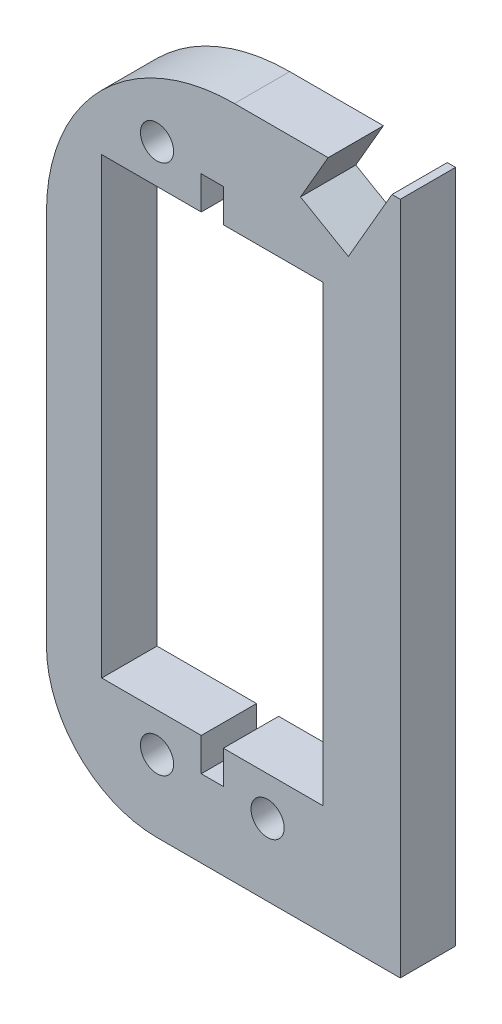
ISO-10303-21;
HEADER;
FILE_DESCRIPTION(('STEP AP214'),'2;1');
FILE_NAME('part.step','',(''),(''),'','','');
FILE_SCHEMA(('AUTOMOTIVE_DESIGN { 1 0 10303 214 1 1 1 1 }'));
ENDSEC;
DATA;
#1=APPLICATION_CONTEXT('core data for automotive mechanical design processes');
#2=APPLICATION_PROTOCOL_DEFINITION('international standard','automotive_design',2000,#1);
#3=PRODUCT_CONTEXT('',#1,'mechanical');
#4=PRODUCT('Part','Part','',(#3));
#5=PRODUCT_RELATED_PRODUCT_CATEGORY('part','',(#4));
#6=PRODUCT_DEFINITION_FORMATION('','',#4);
#7=PRODUCT_DEFINITION_CONTEXT('part definition',#1,'design');
#8=PRODUCT_DEFINITION('design','',#6,#7);
#9=PRODUCT_DEFINITION_SHAPE('','',#8);
#10=(LENGTH_UNIT() NAMED_UNIT(*) SI_UNIT(.MILLI.,.METRE.));
#11=(NAMED_UNIT(*) PLANE_ANGLE_UNIT() SI_UNIT($,.RADIAN.));
#12=(NAMED_UNIT(*) SI_UNIT($,.STERADIAN.) SOLID_ANGLE_UNIT());
#13=UNCERTAINTY_MEASURE_WITH_UNIT(LENGTH_MEASURE(1.E-05),#10,'distance_accuracy_value','');
#14=(GEOMETRIC_REPRESENTATION_CONTEXT(3) GLOBAL_UNCERTAINTY_ASSIGNED_CONTEXT((#13)) GLOBAL_UNIT_ASSIGNED_CONTEXT((#10,
#11,#12)) REPRESENTATION_CONTEXT('',''));
#15=CARTESIAN_POINT('',(0.,0.,0.));
#16=DIRECTION('',(0.,0.,1.));
#17=DIRECTION('',(1.,0.,0.));
#18=AXIS2_PLACEMENT_3D('',#15,#16,#17);
#19=CARTESIAN_POINT('',(0.,0.,5.));
#20=DIRECTION('',(0.,0.,-1.));
#21=DIRECTION('',(-1.,0.,0.));
#22=AXIS2_PLACEMENT_3D('',#19,#20,#21);
#23=PLANE('',#22);
#24=CARTESIAN_POINT('',(20.,6.50000000000001,5.));
#25=DIRECTION('',(0.,0.,1.));
#26=DIRECTION('',(1.,0.,0.));
#27=AXIS2_PLACEMENT_3D('',#24,#25,#26);
#28=CIRCLE('',#27,1.5);
#29=CARTESIAN_POINT('',(21.5,6.50000000000001,5.));
#30=VERTEX_POINT('',#29);
#31=EDGE_CURVE('E673',#30,#30,#28,.T.);
#32=ORIENTED_EDGE('',*,*,#31,.F.);
#33=EDGE_LOOP('',(#32));
#34=FACE_BOUND('',#33,.T.);
#35=DIRECTION('',(1.,0.,0.));
#36=VECTOR('',#35,1.);
#37=CARTESIAN_POINT('',(14.,10.,5.));
#38=LINE('',#37,#36);
#39=CARTESIAN_POINT('',(5.,10.,5.));
#40=VERTEX_POINT('',#39);
#41=CARTESIAN_POINT('',(14.,10.,5.));
#42=VERTEX_POINT('',#41);
#43=EDGE_CURVE('E183',#40,#42,#38,.T.);
#44=ORIENTED_EDGE('',*,*,#43,.F.);
#45=DIRECTION('',(0.,-1.,0.));
#46=VECTOR('',#45,1.);
#47=CARTESIAN_POINT('',(5.,51.,5.));
#48=LINE('',#47,#46);
#49=CARTESIAN_POINT('',(5.,51.,5.));
#50=VERTEX_POINT('',#49);
#51=EDGE_CURVE('E229',#50,#40,#48,.T.);
#52=ORIENTED_EDGE('',*,*,#51,.F.);
#53=DIRECTION('',(-1.,0.,0.));
#54=VECTOR('',#53,1.);
#55=CARTESIAN_POINT('',(14.,51.,5.));
#56=LINE('',#55,#54);
#57=CARTESIAN_POINT('',(14.,51.,5.));
#58=VERTEX_POINT('',#57);
#59=EDGE_CURVE('E226',#58,#50,#56,.T.);
#60=ORIENTED_EDGE('',*,*,#59,.F.);
#61=DIRECTION('',(0.,-1.,0.));
#62=VECTOR('',#61,1.);
#63=CARTESIAN_POINT('',(14.,51.,5.));
#64=LINE('',#63,#62);
#65=CARTESIAN_POINT('',(14.,54.,5.));
#66=VERTEX_POINT('',#65);
#67=EDGE_CURVE('E224',#66,#58,#64,.T.);
#68=ORIENTED_EDGE('',*,*,#67,.F.);
#69=DIRECTION('',(-1.,0.,0.));
#70=VECTOR('',#69,1.);
#71=CARTESIAN_POINT('',(14.,54.,5.));
#72=LINE('',#71,#70);
#73=CARTESIAN_POINT('',(16.,54.,5.));
#74=VERTEX_POINT('',#73);
#75=EDGE_CURVE('E222',#74,#66,#72,.T.);
#76=ORIENTED_EDGE('',*,*,#75,.F.);
#77=DIRECTION('',(0.,1.,0.));
#78=VECTOR('',#77,1.);
#79=CARTESIAN_POINT('',(16.,51.,5.));
#80=LINE('',#79,#78);
#81=CARTESIAN_POINT('',(16.,51.,5.));
#82=VERTEX_POINT('',#81);
#83=EDGE_CURVE('E220',#82,#74,#80,.T.);
#84=ORIENTED_EDGE('',*,*,#83,.F.);
#85=DIRECTION('',(-1.,0.,0.));
#86=VECTOR('',#85,1.);
#87=CARTESIAN_POINT('',(25.,51.,5.));
#88=LINE('',#87,#86);
#89=CARTESIAN_POINT('',(25.,51.,5.));
#90=VERTEX_POINT('',#89);
#91=EDGE_CURVE('E218',#90,#82,#88,.T.);
#92=ORIENTED_EDGE('',*,*,#91,.F.);
#93=DIRECTION('',(0.,1.,0.));
#94=VECTOR('',#93,1.);
#95=CARTESIAN_POINT('',(25.,10.,5.));
#96=LINE('',#95,#94);
#97=CARTESIAN_POINT('',(25.,10.,5.));
#98=VERTEX_POINT('',#97);
#99=EDGE_CURVE('E216',#98,#90,#96,.T.);
#100=ORIENTED_EDGE('',*,*,#99,.F.);
#101=DIRECTION('',(1.,0.,0.));
#102=VECTOR('',#101,1.);
#103=CARTESIAN_POINT('',(25.,10.,5.));
#104=LINE('',#103,#102);
#105=CARTESIAN_POINT('',(16.,10.,5.));
#106=VERTEX_POINT('',#105);
#107=EDGE_CURVE('E214',#106,#98,#104,.T.);
#108=ORIENTED_EDGE('',*,*,#107,.F.);
#109=DIRECTION('',(0.,1.,0.));
#110=VECTOR('',#109,1.);
#111=CARTESIAN_POINT('',(16.,10.,5.));
#112=LINE('',#111,#110);
#113=CARTESIAN_POINT('',(16.,7.00000000000001,5.));
#114=VERTEX_POINT('',#113);
#115=EDGE_CURVE('E209',#114,#106,#112,.T.);
#116=ORIENTED_EDGE('',*,*,#115,.F.);
#117=DIRECTION('',(1.,0.,0.));
#118=VECTOR('',#117,1.);
#119=CARTESIAN_POINT('',(14.,7.00000000000001,5.));
#120=LINE('',#119,#118);
#121=CARTESIAN_POINT('',(14.,7.00000000000001,5.));
#122=VERTEX_POINT('',#121);
#123=EDGE_CURVE('E207',#122,#114,#120,.T.);
#124=ORIENTED_EDGE('',*,*,#123,.F.);
#125=DIRECTION('',(0.,-1.,0.));
#126=VECTOR('',#125,1.);
#127=CARTESIAN_POINT('',(14.,10.,5.));
#128=LINE('',#127,#126);
#129=EDGE_CURVE('E193',#42,#122,#128,.T.);
#130=ORIENTED_EDGE('',*,*,#129,.F.);
#131=EDGE_LOOP('',(#44,#52,#60,#68,#76,#84,#92,#100,#108,#116,#124,#130));
#132=FACE_BOUND('',#131,.T.);
#133=DIRECTION('',(0.,-1.,0.));
#134=VECTOR('',#133,1.);
#135=CARTESIAN_POINT('',(0.,0.,5.));
#136=LINE('',#135,#134);
#137=CARTESIAN_POINT('',(0.,44.,5.));
#138=VERTEX_POINT('',#137);
#139=CARTESIAN_POINT('',(0.,10.,5.));
#140=VERTEX_POINT('',#139);
#141=EDGE_CURVE('E284',#138,#140,#136,.T.);
#142=ORIENTED_EDGE('',*,*,#141,.T.);
#143=CARTESIAN_POINT('',(10.,10.,5.));
#144=DIRECTION('',(0.,0.,-1.));
#145=DIRECTION('',(-1.,0.,0.));
#146=AXIS2_PLACEMENT_3D('',#143,#144,#145);
#147=CIRCLE('',#146,10.);
#148=CARTESIAN_POINT('',(10.,0.,5.));
#149=VERTEX_POINT('',#148);
#150=EDGE_CURVE('E11',#140,#149,#147,.F.);
#151=ORIENTED_EDGE('',*,*,#150,.T.);
#152=DIRECTION('',(1.,0.,0.));
#153=VECTOR('',#152,1.);
#154=CARTESIAN_POINT('',(0.,0.,5.));
#155=LINE('',#154,#153);
#156=CARTESIAN_POINT('',(32.,0.,5.));
#157=VERTEX_POINT('',#156);
#158=EDGE_CURVE('E286',#149,#157,#155,.T.);
#159=ORIENTED_EDGE('',*,*,#158,.T.);
#160=DIRECTION('',(0.,1.,0.));
#161=VECTOR('',#160,1.);
#162=CARTESIAN_POINT('',(32.,0.,5.));
#163=LINE('',#162,#161);
#164=CARTESIAN_POINT('',(32.,61.,5.));
#165=VERTEX_POINT('',#164);
#166=EDGE_CURVE('E289',#157,#165,#163,.T.);
#167=ORIENTED_EDGE('',*,*,#166,.T.);
#168=DIRECTION('',(-1.,0.,0.));
#169=VECTOR('',#168,1.);
#170=CARTESIAN_POINT('',(31.2507855627294,61.,5.));
#171=LINE('',#170,#169);
#172=CARTESIAN_POINT('',(31.2507855627294,61.,5.));
#173=VERTEX_POINT('',#172);
#174=EDGE_CURVE('E291',#165,#173,#171,.T.);
#175=ORIENTED_EDGE('',*,*,#174,.T.);
#176=DIRECTION('',(-0.5,-0.866025403784438,0.));
#177=VECTOR('',#176,1.);
#178=CARTESIAN_POINT('',(31.2507855627294,61.,5.));
#179=LINE('',#178,#177);
#180=CARTESIAN_POINT('',(27.3074098897553,54.1698729810778,5.));
#181=VERTEX_POINT('',#180);
#182=EDGE_CURVE('E293',#173,#181,#179,.T.);
#183=ORIENTED_EDGE('',*,*,#182,.T.);
#184=DIRECTION('',(-0.866025403784438,0.500000000000001,0.));
#185=VECTOR('',#184,1.);
#186=CARTESIAN_POINT('',(27.3074098897553,54.1698729810778,5.));
#187=LINE('',#186,#185);
#188=CARTESIAN_POINT('',(22.9772828708331,56.6698729810778,5.));
#189=VERTEX_POINT('',#188);
#190=EDGE_CURVE('E295',#181,#189,#187,.T.);
#191=ORIENTED_EDGE('',*,*,#190,.T.);
#192=DIRECTION('',(0.499999999999998,0.86602540378444,0.));
#193=VECTOR('',#192,1.);
#194=CARTESIAN_POINT('',(22.9772828708331,56.6698729810778,5.));
#195=LINE('',#194,#193);
#196=CARTESIAN_POINT('',(25.4772828708331,61.,5.));
#197=VERTEX_POINT('',#196);
#198=EDGE_CURVE('E297',#189,#197,#195,.T.);
#199=ORIENTED_EDGE('',*,*,#198,.T.);
#200=DIRECTION('',(-1.,0.,0.));
#201=VECTOR('',#200,1.);
#202=CARTESIAN_POINT('',(15.,61.,5.));
#203=LINE('',#202,#201);
#204=CARTESIAN_POINT('',(17.,61.,5.));
#205=VERTEX_POINT('',#204);
#206=EDGE_CURVE('E299',#197,#205,#203,.T.);
#207=ORIENTED_EDGE('',*,*,#206,.T.);
#208=CARTESIAN_POINT('',(17.,44.,5.));
#209=DIRECTION('',(0.,0.,-1.));
#210=DIRECTION('',(-1.,0.,0.));
#211=AXIS2_PLACEMENT_3D('',#208,#209,#210);
#212=CIRCLE('',#211,17.);
#213=EDGE_CURVE('E343',#205,#138,#212,.F.);
#214=ORIENTED_EDGE('',*,*,#213,.T.);
#215=EDGE_LOOP('',(#142,#151,#159,#167,#175,#183,#191,#199,#207,#214));
#216=FACE_BOUND('',#215,.T.);
#217=CARTESIAN_POINT('',(9.99999999999999,54.5,5.));
#218=DIRECTION('',(0.,0.,1.));
#219=DIRECTION('',(1.,0.,0.));
#220=AXIS2_PLACEMENT_3D('',#217,#218,#219);
#221=CIRCLE('',#220,1.5);
#222=CARTESIAN_POINT('',(11.5,54.5,5.));
#223=VERTEX_POINT('',#222);
#224=EDGE_CURVE('E233',#223,#223,#221,.T.);
#225=ORIENTED_EDGE('',*,*,#224,.F.);
#226=EDGE_LOOP('',(#225));
#227=FACE_BOUND('',#226,.T.);
#228=CARTESIAN_POINT('',(9.99999999999999,6.50000000000001,5.));
#229=DIRECTION('',(0.,0.,1.));
#230=DIRECTION('',(-1.,0.,0.));
#231=AXIS2_PLACEMENT_3D('',#228,#229,#230);
#232=CIRCLE('',#231,1.5);
#233=CARTESIAN_POINT('',(8.49999999999999,6.50000000000001,5.));
#234=VERTEX_POINT('',#233);
#235=EDGE_CURVE('E680',#234,#234,#232,.T.);
#236=ORIENTED_EDGE('',*,*,#235,.F.);
#237=EDGE_LOOP('',(#236));
#238=FACE_BOUND('',#237,.T.);
#239=ADVANCED_FACE('F33',(#34,#132,#216,#227,#238),#23,.F.);
#240=CARTESIAN_POINT('',(0.,0.,0.));
#241=DIRECTION('',(0.,0.,-1.));
#242=DIRECTION('',(-1.,0.,0.));
#243=AXIS2_PLACEMENT_3D('',#240,#241,#242);
#244=PLANE('',#243);
#245=CARTESIAN_POINT('',(20.,6.50000000000001,0.));
#246=DIRECTION('',(0.,0.,1.));
#247=DIRECTION('',(1.,0.,0.));
#248=AXIS2_PLACEMENT_3D('',#245,#246,#247);
#249=CIRCLE('',#248,1.5);
#250=CARTESIAN_POINT('',(21.5,6.50000000000001,0.));
#251=VERTEX_POINT('',#250);
#252=EDGE_CURVE('E676',#251,#251,#249,.T.);
#253=ORIENTED_EDGE('',*,*,#252,.T.);
#254=EDGE_LOOP('',(#253));
#255=FACE_BOUND('',#254,.T.);
#256=DIRECTION('',(0.,-1.,0.));
#257=VECTOR('',#256,1.);
#258=CARTESIAN_POINT('',(5.,51.,0.));
#259=LINE('',#258,#257);
#260=CARTESIAN_POINT('',(5.,51.,0.));
#261=VERTEX_POINT('',#260);
#262=CARTESIAN_POINT('',(5.,10.,0.));
#263=VERTEX_POINT('',#262);
#264=EDGE_CURVE('E194',#261,#263,#259,.T.);
#265=ORIENTED_EDGE('',*,*,#264,.T.);
#266=DIRECTION('',(1.,0.,0.));
#267=VECTOR('',#266,1.);
#268=CARTESIAN_POINT('',(14.,10.,0.));
#269=LINE('',#268,#267);
#270=CARTESIAN_POINT('',(14.,10.,0.));
#271=VERTEX_POINT('',#270);
#272=EDGE_CURVE('E231',#263,#271,#269,.T.);
#273=ORIENTED_EDGE('',*,*,#272,.T.);
#274=DIRECTION('',(0.,-1.,0.));
#275=VECTOR('',#274,1.);
#276=CARTESIAN_POINT('',(14.,10.,0.));
#277=LINE('',#276,#275);
#278=CARTESIAN_POINT('',(14.,7.00000000000001,0.));
#279=VERTEX_POINT('',#278);
#280=EDGE_CURVE('E200',#271,#279,#277,.T.);
#281=ORIENTED_EDGE('',*,*,#280,.T.);
#282=DIRECTION('',(1.,0.,0.));
#283=VECTOR('',#282,1.);
#284=CARTESIAN_POINT('',(14.,7.00000000000001,0.));
#285=LINE('',#284,#283);
#286=CARTESIAN_POINT('',(16.,7.00000000000001,0.));
#287=VERTEX_POINT('',#286);
#288=EDGE_CURVE('E235',#279,#287,#285,.T.);
#289=ORIENTED_EDGE('',*,*,#288,.T.);
#290=DIRECTION('',(0.,1.,0.));
#291=VECTOR('',#290,1.);
#292=CARTESIAN_POINT('',(16.,10.,0.));
#293=LINE('',#292,#291);
#294=CARTESIAN_POINT('',(16.,10.,0.));
#295=VERTEX_POINT('',#294);
#296=EDGE_CURVE('E238',#287,#295,#293,.T.);
#297=ORIENTED_EDGE('',*,*,#296,.T.);
#298=DIRECTION('',(1.,0.,0.));
#299=VECTOR('',#298,1.);
#300=CARTESIAN_POINT('',(25.,10.,0.));
#301=LINE('',#300,#299);
#302=CARTESIAN_POINT('',(25.,10.,0.));
#303=VERTEX_POINT('',#302);
#304=EDGE_CURVE('E241',#295,#303,#301,.T.);
#305=ORIENTED_EDGE('',*,*,#304,.T.);
#306=DIRECTION('',(0.,1.,0.));
#307=VECTOR('',#306,1.);
#308=CARTESIAN_POINT('',(25.,10.,0.));
#309=LINE('',#308,#307);
#310=CARTESIAN_POINT('',(25.,51.,0.));
#311=VERTEX_POINT('',#310);
#312=EDGE_CURVE('E244',#303,#311,#309,.T.);
#313=ORIENTED_EDGE('',*,*,#312,.T.);
#314=DIRECTION('',(-1.,0.,0.));
#315=VECTOR('',#314,1.);
#316=CARTESIAN_POINT('',(25.,51.,0.));
#317=LINE('',#316,#315);
#318=CARTESIAN_POINT('',(16.,51.,0.));
#319=VERTEX_POINT('',#318);
#320=EDGE_CURVE('E247',#311,#319,#317,.T.);
#321=ORIENTED_EDGE('',*,*,#320,.T.);
#322=DIRECTION('',(0.,1.,0.));
#323=VECTOR('',#322,1.);
#324=CARTESIAN_POINT('',(16.,51.,0.));
#325=LINE('',#324,#323);
#326=CARTESIAN_POINT('',(16.,54.,0.));
#327=VERTEX_POINT('',#326);
#328=EDGE_CURVE('E250',#319,#327,#325,.T.);
#329=ORIENTED_EDGE('',*,*,#328,.T.);
#330=DIRECTION('',(-1.,0.,0.));
#331=VECTOR('',#330,1.);
#332=CARTESIAN_POINT('',(14.,54.,0.));
#333=LINE('',#332,#331);
#334=CARTESIAN_POINT('',(14.,54.,0.));
#335=VERTEX_POINT('',#334);
#336=EDGE_CURVE('E253',#327,#335,#333,.T.);
#337=ORIENTED_EDGE('',*,*,#336,.T.);
#338=DIRECTION('',(0.,-1.,0.));
#339=VECTOR('',#338,1.);
#340=CARTESIAN_POINT('',(14.,51.,0.));
#341=LINE('',#340,#339);
#342=CARTESIAN_POINT('',(14.,51.,0.));
#343=VERTEX_POINT('',#342);
#344=EDGE_CURVE('E256',#335,#343,#341,.T.);
#345=ORIENTED_EDGE('',*,*,#344,.T.);
#346=DIRECTION('',(-1.,0.,0.));
#347=VECTOR('',#346,1.);
#348=CARTESIAN_POINT('',(14.,51.,0.));
#349=LINE('',#348,#347);
#350=EDGE_CURVE('E259',#343,#261,#349,.T.);
#351=ORIENTED_EDGE('',*,*,#350,.T.);
#352=EDGE_LOOP('',(#265,#273,#281,#289,#297,#305,#313,#321,#329,#337,#345,#351));
#353=FACE_BOUND('',#352,.T.);
#354=DIRECTION('',(1.,0.,0.));
#355=VECTOR('',#354,1.);
#356=CARTESIAN_POINT('',(25.,0.,0.));
#357=LINE('',#356,#355);
#358=CARTESIAN_POINT('',(10.,0.,0.));
#359=VERTEX_POINT('',#358);
#360=CARTESIAN_POINT('',(32.,0.,0.));
#361=VERTEX_POINT('',#360);
#362=EDGE_CURVE('E304',#359,#361,#357,.T.);
#363=ORIENTED_EDGE('',*,*,#362,.F.);
#364=CARTESIAN_POINT('',(10.,10.,0.));
#365=DIRECTION('',(0.,0.,-1.));
#366=DIRECTION('',(-1.,0.,0.));
#367=AXIS2_PLACEMENT_3D('',#364,#365,#366);
#368=CIRCLE('',#367,10.);
#369=CARTESIAN_POINT('',(0.,10.,0.));
#370=VERTEX_POINT('',#369);
#371=EDGE_CURVE('E55',#359,#370,#368,.T.);
#372=ORIENTED_EDGE('',*,*,#371,.T.);
#373=DIRECTION('',(0.,-1.,0.));
#374=VECTOR('',#373,1.);
#375=CARTESIAN_POINT('',(0.,0.,0.));
#376=LINE('',#375,#374);
#377=CARTESIAN_POINT('',(0.,44.,0.));
#378=VERTEX_POINT('',#377);
#379=EDGE_CURVE('E201',#378,#370,#376,.T.);
#380=ORIENTED_EDGE('',*,*,#379,.F.);
#381=CARTESIAN_POINT('',(17.,44.,0.));
#382=DIRECTION('',(0.,0.,-1.));
#383=DIRECTION('',(-1.,0.,0.));
#384=AXIS2_PLACEMENT_3D('',#381,#382,#383);
#385=CIRCLE('',#384,17.);
#386=CARTESIAN_POINT('',(17.,61.,0.));
#387=VERTEX_POINT('',#386);
#388=EDGE_CURVE('E339',#378,#387,#385,.T.);
#389=ORIENTED_EDGE('',*,*,#388,.T.);
#390=DIRECTION('',(-1.,0.,0.));
#391=VECTOR('',#390,1.);
#392=CARTESIAN_POINT('',(0.,61.,0.));
#393=LINE('',#392,#391);
#394=CARTESIAN_POINT('',(25.4772828708331,61.,0.));
#395=VERTEX_POINT('',#394);
#396=EDGE_CURVE('E287',#395,#387,#393,.T.);
#397=ORIENTED_EDGE('',*,*,#396,.F.);
#398=DIRECTION('',(0.499999999999998,0.86602540378444,0.));
#399=VECTOR('',#398,1.);
#400=CARTESIAN_POINT('',(22.9772828708331,56.6698729810778,0.));
#401=LINE('',#400,#399);
#402=CARTESIAN_POINT('',(22.9772828708331,56.6698729810778,0.));
#403=VERTEX_POINT('',#402);
#404=EDGE_CURVE('E314',#403,#395,#401,.T.);
#405=ORIENTED_EDGE('',*,*,#404,.F.);
#406=DIRECTION('',(-0.866025403784438,0.500000000000001,0.));
#407=VECTOR('',#406,1.);
#408=CARTESIAN_POINT('',(27.3074098897553,54.1698729810778,0.));
#409=LINE('',#408,#407);
#410=CARTESIAN_POINT('',(27.3074098897553,54.1698729810778,0.));
#411=VERTEX_POINT('',#410);
#412=EDGE_CURVE('E312',#411,#403,#409,.T.);
#413=ORIENTED_EDGE('',*,*,#412,.F.);
#414=DIRECTION('',(-0.5,-0.866025403784438,0.));
#415=VECTOR('',#414,1.);
#416=CARTESIAN_POINT('',(31.2507855627294,61.,0.));
#417=LINE('',#416,#415);
#418=CARTESIAN_POINT('',(31.2507855627294,61.,0.));
#419=VERTEX_POINT('',#418);
#420=EDGE_CURVE('E310',#419,#411,#417,.T.);
#421=ORIENTED_EDGE('',*,*,#420,.F.);
#422=DIRECTION('',(-1.,0.,0.));
#423=VECTOR('',#422,1.);
#424=CARTESIAN_POINT('',(31.2507855627294,61.,0.));
#425=LINE('',#424,#423);
#426=CARTESIAN_POINT('',(32.,61.,0.));
#427=VERTEX_POINT('',#426);
#428=EDGE_CURVE('E308',#427,#419,#425,.T.);
#429=ORIENTED_EDGE('',*,*,#428,.F.);
#430=DIRECTION('',(0.,1.,0.));
#431=VECTOR('',#430,1.);
#432=CARTESIAN_POINT('',(32.,0.,0.));
#433=LINE('',#432,#431);
#434=EDGE_CURVE('E306',#361,#427,#433,.T.);
#435=ORIENTED_EDGE('',*,*,#434,.F.);
#436=EDGE_LOOP('',(#363,#372,#380,#389,#397,#405,#413,#421,#429,#435));
#437=FACE_BOUND('',#436,.T.);
#438=CARTESIAN_POINT('',(9.99999999999999,54.5,0.));
#439=DIRECTION('',(0.,0.,1.));
#440=DIRECTION('',(1.,0.,0.));
#441=AXIS2_PLACEMENT_3D('',#438,#439,#440);
#442=CIRCLE('',#441,1.5);
#443=CARTESIAN_POINT('',(11.5,54.5,0.));
#444=VERTEX_POINT('',#443);
#445=EDGE_CURVE('E672',#444,#444,#442,.T.);
#446=ORIENTED_EDGE('',*,*,#445,.T.);
#447=EDGE_LOOP('',(#446));
#448=FACE_BOUND('',#447,.T.);
#449=CARTESIAN_POINT('',(9.99999999999999,6.50000000000001,0.));
#450=DIRECTION('',(0.,0.,1.));
#451=DIRECTION('',(-1.,0.,0.));
#452=AXIS2_PLACEMENT_3D('',#449,#450,#451);
#453=CIRCLE('',#452,1.5);
#454=CARTESIAN_POINT('',(8.49999999999999,6.50000000000001,0.));
#455=VERTEX_POINT('',#454);
#456=EDGE_CURVE('E682',#455,#455,#453,.T.);
#457=ORIENTED_EDGE('',*,*,#456,.T.);
#458=EDGE_LOOP('',(#457));
#459=FACE_BOUND('',#458,.T.);
#460=ADVANCED_FACE('F356',(#255,#353,#437,#448,#459),#244,.T.);
#461=CARTESIAN_POINT('',(0.,0.,5.));
#462=DIRECTION('',(1.,0.,0.));
#463=DIRECTION('',(0.,0.,-1.));
#464=AXIS2_PLACEMENT_3D('',#461,#462,#463);
#465=PLANE('',#464);
#466=ORIENTED_EDGE('',*,*,#379,.T.);
#467=DIRECTION('',(0.,0.,-1.));
#468=VECTOR('',#467,1.);
#469=CARTESIAN_POINT('',(0.,10.,5.));
#470=LINE('',#469,#468);
#471=EDGE_CURVE('E41',#370,#140,#470,.F.);
#472=ORIENTED_EDGE('',*,*,#471,.T.);
#473=ORIENTED_EDGE('',*,*,#141,.F.);
#474=DIRECTION('',(0.,0.,-1.));
#475=VECTOR('',#474,1.);
#476=CARTESIAN_POINT('',(0.,44.,5.));
#477=LINE('',#476,#475);
#478=EDGE_CURVE('E336',#138,#378,#477,.T.);
#479=ORIENTED_EDGE('',*,*,#478,.T.);
#480=EDGE_LOOP('',(#466,#472,#473,#479));
#481=FACE_BOUND('',#480,.T.);
#482=ADVANCED_FACE('F385',(#481),#465,.F.);
#483=CARTESIAN_POINT('',(25.,0.,5.));
#484=DIRECTION('',(0.,1.,0.));
#485=DIRECTION('',(0.,0.,1.));
#486=AXIS2_PLACEMENT_3D('',#483,#484,#485);
#487=PLANE('',#486);
#488=ORIENTED_EDGE('',*,*,#158,.F.);
#489=DIRECTION('',(0.,0.,-1.));
#490=VECTOR('',#489,1.);
#491=CARTESIAN_POINT('',(10.,0.,5.));
#492=LINE('',#491,#490);
#493=EDGE_CURVE('E345',#149,#359,#492,.T.);
#494=ORIENTED_EDGE('',*,*,#493,.T.);
#495=ORIENTED_EDGE('',*,*,#362,.T.);
#496=DIRECTION('',(0.,0.,-1.));
#497=VECTOR('',#496,1.);
#498=CARTESIAN_POINT('',(32.,0.,5.));
#499=LINE('',#498,#497);
#500=EDGE_CURVE('E333',#157,#361,#499,.T.);
#501=ORIENTED_EDGE('',*,*,#500,.F.);
#502=EDGE_LOOP('',(#488,#494,#495,#501));
#503=FACE_BOUND('',#502,.T.);
#504=ADVANCED_FACE('F351',(#503),#487,.F.);
#505=CARTESIAN_POINT('',(32.,0.,5.));
#506=DIRECTION('',(-1.,0.,0.));
#507=DIRECTION('',(0.,0.,1.));
#508=AXIS2_PLACEMENT_3D('',#505,#506,#507);
#509=PLANE('',#508);
#510=ORIENTED_EDGE('',*,*,#434,.T.);
#511=DIRECTION('',(0.,0.,-1.));
#512=VECTOR('',#511,1.);
#513=CARTESIAN_POINT('',(32.,61.,5.));
#514=LINE('',#513,#512);
#515=EDGE_CURVE('E330',#165,#427,#514,.T.);
#516=ORIENTED_EDGE('',*,*,#515,.F.);
#517=ORIENTED_EDGE('',*,*,#166,.F.);
#518=ORIENTED_EDGE('',*,*,#500,.T.);
#519=EDGE_LOOP('',(#510,#516,#517,#518));
#520=FACE_BOUND('',#519,.T.);
#521=ADVANCED_FACE('F362',(#520),#509,.F.);
#522=CARTESIAN_POINT('',(31.2507855627294,61.,5.));
#523=DIRECTION('',(0.,-1.,0.));
#524=DIRECTION('',(0.,0.,-1.));
#525=AXIS2_PLACEMENT_3D('',#522,#523,#524);
#526=PLANE('',#525);
#527=ORIENTED_EDGE('',*,*,#428,.T.);
#528=DIRECTION('',(0.,0.,-1.));
#529=VECTOR('',#528,1.);
#530=CARTESIAN_POINT('',(31.2507855627294,61.,5.));
#531=LINE('',#530,#529);
#532=EDGE_CURVE('E327',#173,#419,#531,.T.);
#533=ORIENTED_EDGE('',*,*,#532,.F.);
#534=ORIENTED_EDGE('',*,*,#174,.F.);
#535=ORIENTED_EDGE('',*,*,#515,.T.);
#536=EDGE_LOOP('',(#527,#533,#534,#535));
#537=FACE_BOUND('',#536,.T.);
#538=ADVANCED_FACE('F366',(#537),#526,.F.);
#539=CARTESIAN_POINT('',(31.2507855627294,61.,5.));
#540=DIRECTION('',(0.866025403784439,-0.5,0.));
#541=DIRECTION('',(0.5,0.866025403784439,0.));
#542=AXIS2_PLACEMENT_3D('',#539,#540,#541);
#543=PLANE('',#542);
#544=ORIENTED_EDGE('',*,*,#420,.T.);
#545=DIRECTION('',(0.,0.,-1.));
#546=VECTOR('',#545,1.);
#547=CARTESIAN_POINT('',(27.3074098897553,54.1698729810778,5.));
#548=LINE('',#547,#546);
#549=EDGE_CURVE('E324',#181,#411,#548,.T.);
#550=ORIENTED_EDGE('',*,*,#549,.F.);
#551=ORIENTED_EDGE('',*,*,#182,.F.);
#552=ORIENTED_EDGE('',*,*,#532,.T.);
#553=EDGE_LOOP('',(#544,#550,#551,#552));
#554=FACE_BOUND('',#553,.T.);
#555=ADVANCED_FACE('F403',(#554),#543,.F.);
#556=CARTESIAN_POINT('',(27.3074098897553,54.1698729810778,5.));
#557=DIRECTION('',(-0.500000000000001,-0.866025403784438,0.));
#558=DIRECTION('',(0.866025403784438,-0.500000000000001,0.));
#559=AXIS2_PLACEMENT_3D('',#556,#557,#558);
#560=PLANE('',#559);
#561=ORIENTED_EDGE('',*,*,#412,.T.);
#562=DIRECTION('',(0.,0.,-1.));
#563=VECTOR('',#562,1.);
#564=CARTESIAN_POINT('',(22.9772828708331,56.6698729810778,5.));
#565=LINE('',#564,#563);
#566=EDGE_CURVE('E321',#189,#403,#565,.T.);
#567=ORIENTED_EDGE('',*,*,#566,.F.);
#568=ORIENTED_EDGE('',*,*,#190,.F.);
#569=ORIENTED_EDGE('',*,*,#549,.T.);
#570=EDGE_LOOP('',(#561,#567,#568,#569));
#571=FACE_BOUND('',#570,.T.);
#572=ADVANCED_FACE('F399',(#571),#560,.F.);
#573=CARTESIAN_POINT('',(22.9772828708331,56.6698729810778,5.));
#574=DIRECTION('',(-0.86602540378444,0.499999999999998,0.));
#575=DIRECTION('',(-0.499999999999998,-0.86602540378444,0.));
#576=AXIS2_PLACEMENT_3D('',#573,#574,#575);
#577=PLANE('',#576);
#578=ORIENTED_EDGE('',*,*,#404,.T.);
#579=DIRECTION('',(0.,0.,-1.));
#580=VECTOR('',#579,1.);
#581=CARTESIAN_POINT('',(25.4772828708331,61.,5.));
#582=LINE('',#581,#580);
#583=EDGE_CURVE('E302',#197,#395,#582,.T.);
#584=ORIENTED_EDGE('',*,*,#583,.F.);
#585=ORIENTED_EDGE('',*,*,#198,.F.);
#586=ORIENTED_EDGE('',*,*,#566,.T.);
#587=EDGE_LOOP('',(#578,#584,#585,#586));
#588=FACE_BOUND('',#587,.T.);
#589=ADVANCED_FACE('F395',(#588),#577,.F.);
#590=CARTESIAN_POINT('',(0.,61.,5.));
#591=DIRECTION('',(0.,-1.,0.));
#592=DIRECTION('',(0.,0.,-1.));
#593=AXIS2_PLACEMENT_3D('',#590,#591,#592);
#594=PLANE('',#593);
#595=ORIENTED_EDGE('',*,*,#396,.T.);
#596=DIRECTION('',(0.,0.,-1.));
#597=VECTOR('',#596,1.);
#598=CARTESIAN_POINT('',(17.,61.,5.));
#599=LINE('',#598,#597);
#600=EDGE_CURVE('E341',#387,#205,#599,.F.);
#601=ORIENTED_EDGE('',*,*,#600,.T.);
#602=ORIENTED_EDGE('',*,*,#206,.F.);
#603=ORIENTED_EDGE('',*,*,#583,.T.);
#604=EDGE_LOOP('',(#595,#601,#602,#603));
#605=FACE_BOUND('',#604,.T.);
#606=ADVANCED_FACE('F392',(#605),#594,.F.);
#607=CARTESIAN_POINT('',(14.,10.,5.));
#608=DIRECTION('',(0.,1.,0.));
#609=DIRECTION('',(-1.,0.,0.));
#610=AXIS2_PLACEMENT_3D('',#607,#608,#609);
#611=PLANE('',#610);
#612=ORIENTED_EDGE('',*,*,#272,.F.);
#613=DIRECTION('',(0.,0.,-1.));
#614=VECTOR('',#613,1.);
#615=CARTESIAN_POINT('',(5.,10.,5.));
#616=LINE('',#615,#614);
#617=EDGE_CURVE('E189',#40,#263,#616,.T.);
#618=ORIENTED_EDGE('',*,*,#617,.F.);
#619=ORIENTED_EDGE('',*,*,#43,.T.);
#620=DIRECTION('',(0.,0.,-1.));
#621=VECTOR('',#620,1.);
#622=CARTESIAN_POINT('',(14.,10.,5.));
#623=LINE('',#622,#621);
#624=EDGE_CURVE('E186',#42,#271,#623,.T.);
#625=ORIENTED_EDGE('',*,*,#624,.T.);
#626=EDGE_LOOP('',(#612,#618,#619,#625));
#627=FACE_BOUND('',#626,.T.);
#628=ADVANCED_FACE('F185',(#627),#611,.T.);
#629=CARTESIAN_POINT('',(14.,10.,5.));
#630=DIRECTION('',(1.,0.,0.));
#631=DIRECTION('',(0.,0.,-1.));
#632=AXIS2_PLACEMENT_3D('',#629,#630,#631);
#633=PLANE('',#632);
#634=ORIENTED_EDGE('',*,*,#280,.F.);
#635=ORIENTED_EDGE('',*,*,#624,.F.);
#636=ORIENTED_EDGE('',*,*,#129,.T.);
#637=DIRECTION('',(0.,0.,-1.));
#638=VECTOR('',#637,1.);
#639=CARTESIAN_POINT('',(14.,7.00000000000001,5.));
#640=LINE('',#639,#638);
#641=EDGE_CURVE('E202',#122,#279,#640,.T.);
#642=ORIENTED_EDGE('',*,*,#641,.T.);
#643=EDGE_LOOP('',(#634,#635,#636,#642));
#644=FACE_BOUND('',#643,.T.);
#645=ADVANCED_FACE('F197',(#644),#633,.T.);
#646=CARTESIAN_POINT('',(14.,7.00000000000001,5.));
#647=DIRECTION('',(0.,1.,0.));
#648=DIRECTION('',(0.,0.,1.));
#649=AXIS2_PLACEMENT_3D('',#646,#647,#648);
#650=PLANE('',#649);
#651=ORIENTED_EDGE('',*,*,#288,.F.);
#652=ORIENTED_EDGE('',*,*,#641,.F.);
#653=ORIENTED_EDGE('',*,*,#123,.T.);
#654=DIRECTION('',(0.,0.,-1.));
#655=VECTOR('',#654,1.);
#656=CARTESIAN_POINT('',(16.,7.00000000000001,5.));
#657=LINE('',#656,#655);
#658=EDGE_CURVE('E281',#114,#287,#657,.T.);
#659=ORIENTED_EDGE('',*,*,#658,.T.);
#660=EDGE_LOOP('',(#651,#652,#653,#659));
#661=FACE_BOUND('',#660,.T.);
#662=ADVANCED_FACE('F549',(#661),#650,.T.);
#663=CARTESIAN_POINT('',(16.,10.,5.));
#664=DIRECTION('',(-1.,0.,0.));
#665=DIRECTION('',(0.,0.,1.));
#666=AXIS2_PLACEMENT_3D('',#663,#664,#665);
#667=PLANE('',#666);
#668=ORIENTED_EDGE('',*,*,#296,.F.);
#669=ORIENTED_EDGE('',*,*,#658,.F.);
#670=ORIENTED_EDGE('',*,*,#115,.T.);
#671=DIRECTION('',(0.,0.,-1.));
#672=VECTOR('',#671,1.);
#673=CARTESIAN_POINT('',(16.,10.,5.));
#674=LINE('',#673,#672);
#675=EDGE_CURVE('E279',#106,#295,#674,.T.);
#676=ORIENTED_EDGE('',*,*,#675,.T.);
#677=EDGE_LOOP('',(#668,#669,#670,#676));
#678=FACE_BOUND('',#677,.T.);
#679=ADVANCED_FACE('F540',(#678),#667,.T.);
#680=CARTESIAN_POINT('',(25.,10.,5.));
#681=DIRECTION('',(0.,1.,0.));
#682=DIRECTION('',(-1.,0.,0.));
#683=AXIS2_PLACEMENT_3D('',#680,#681,#682);
#684=PLANE('',#683);
#685=ORIENTED_EDGE('',*,*,#304,.F.);
#686=ORIENTED_EDGE('',*,*,#675,.F.);
#687=ORIENTED_EDGE('',*,*,#107,.T.);
#688=DIRECTION('',(0.,0.,-1.));
#689=VECTOR('',#688,1.);
#690=CARTESIAN_POINT('',(25.,10.,5.));
#691=LINE('',#690,#689);
#692=EDGE_CURVE('E277',#98,#303,#691,.T.);
#693=ORIENTED_EDGE('',*,*,#692,.T.);
#694=EDGE_LOOP('',(#685,#686,#687,#693));
#695=FACE_BOUND('',#694,.T.);
#696=ADVANCED_FACE('F531',(#695),#684,.T.);
#697=CARTESIAN_POINT('',(25.,10.,5.));
#698=DIRECTION('',(-1.,0.,0.));
#699=DIRECTION('',(0.,-1.,0.));
#700=AXIS2_PLACEMENT_3D('',#697,#698,#699);
#701=PLANE('',#700);
#702=ORIENTED_EDGE('',*,*,#312,.F.);
#703=ORIENTED_EDGE('',*,*,#692,.F.);
#704=ORIENTED_EDGE('',*,*,#99,.T.);
#705=DIRECTION('',(0.,0.,-1.));
#706=VECTOR('',#705,1.);
#707=CARTESIAN_POINT('',(25.,51.,5.));
#708=LINE('',#707,#706);
#709=EDGE_CURVE('E275',#90,#311,#708,.T.);
#710=ORIENTED_EDGE('',*,*,#709,.T.);
#711=EDGE_LOOP('',(#702,#703,#704,#710));
#712=FACE_BOUND('',#711,.T.);
#713=ADVANCED_FACE('F522',(#712),#701,.T.);
#714=CARTESIAN_POINT('',(25.,51.,5.));
#715=DIRECTION('',(0.,-1.,0.));
#716=DIRECTION('',(0.,0.,-1.));
#717=AXIS2_PLACEMENT_3D('',#714,#715,#716);
#718=PLANE('',#717);
#719=ORIENTED_EDGE('',*,*,#320,.F.);
#720=ORIENTED_EDGE('',*,*,#709,.F.);
#721=ORIENTED_EDGE('',*,*,#91,.T.);
#722=DIRECTION('',(0.,0.,-1.));
#723=VECTOR('',#722,1.);
#724=CARTESIAN_POINT('',(16.,51.,5.));
#725=LINE('',#724,#723);
#726=EDGE_CURVE('E273',#82,#319,#725,.T.);
#727=ORIENTED_EDGE('',*,*,#726,.T.);
#728=EDGE_LOOP('',(#719,#720,#721,#727));
#729=FACE_BOUND('',#728,.T.);
#730=ADVANCED_FACE('F513',(#729),#718,.T.);
#731=CARTESIAN_POINT('',(16.,51.,5.));
#732=DIRECTION('',(-1.,0.,0.));
#733=DIRECTION('',(0.,0.,1.));
#734=AXIS2_PLACEMENT_3D('',#731,#732,#733);
#735=PLANE('',#734);
#736=ORIENTED_EDGE('',*,*,#328,.F.);
#737=ORIENTED_EDGE('',*,*,#726,.F.);
#738=ORIENTED_EDGE('',*,*,#83,.T.);
#739=DIRECTION('',(0.,0.,-1.));
#740=VECTOR('',#739,1.);
#741=CARTESIAN_POINT('',(16.,54.,5.));
#742=LINE('',#741,#740);
#743=EDGE_CURVE('E271',#74,#327,#742,.T.);
#744=ORIENTED_EDGE('',*,*,#743,.T.);
#745=EDGE_LOOP('',(#736,#737,#738,#744));
#746=FACE_BOUND('',#745,.T.);
#747=ADVANCED_FACE('F504',(#746),#735,.T.);
#748=CARTESIAN_POINT('',(14.,54.,5.));
#749=DIRECTION('',(0.,-1.,0.));
#750=DIRECTION('',(0.,0.,-1.));
#751=AXIS2_PLACEMENT_3D('',#748,#749,#750);
#752=PLANE('',#751);
#753=ORIENTED_EDGE('',*,*,#336,.F.);
#754=ORIENTED_EDGE('',*,*,#743,.F.);
#755=ORIENTED_EDGE('',*,*,#75,.T.);
#756=DIRECTION('',(0.,0.,-1.));
#757=VECTOR('',#756,1.);
#758=CARTESIAN_POINT('',(14.,54.,5.));
#759=LINE('',#758,#757);
#760=EDGE_CURVE('E269',#66,#335,#759,.T.);
#761=ORIENTED_EDGE('',*,*,#760,.T.);
#762=EDGE_LOOP('',(#753,#754,#755,#761));
#763=FACE_BOUND('',#762,.T.);
#764=ADVANCED_FACE('F495',(#763),#752,.T.);
#765=CARTESIAN_POINT('',(14.,51.,5.));
#766=DIRECTION('',(1.,0.,0.));
#767=DIRECTION('',(0.,0.,-1.));
#768=AXIS2_PLACEMENT_3D('',#765,#766,#767);
#769=PLANE('',#768);
#770=ORIENTED_EDGE('',*,*,#344,.F.);
#771=ORIENTED_EDGE('',*,*,#760,.F.);
#772=ORIENTED_EDGE('',*,*,#67,.T.);
#773=DIRECTION('',(0.,0.,-1.));
#774=VECTOR('',#773,1.);
#775=CARTESIAN_POINT('',(14.,51.,5.));
#776=LINE('',#775,#774);
#777=EDGE_CURVE('E267',#58,#343,#776,.T.);
#778=ORIENTED_EDGE('',*,*,#777,.T.);
#779=EDGE_LOOP('',(#770,#771,#772,#778));
#780=FACE_BOUND('',#779,.T.);
#781=ADVANCED_FACE('F486',(#780),#769,.T.);
#782=CARTESIAN_POINT('',(14.,51.,5.));
#783=DIRECTION('',(0.,-1.,0.));
#784=DIRECTION('',(0.,0.,-1.));
#785=AXIS2_PLACEMENT_3D('',#782,#783,#784);
#786=PLANE('',#785);
#787=ORIENTED_EDGE('',*,*,#350,.F.);
#788=ORIENTED_EDGE('',*,*,#777,.F.);
#789=ORIENTED_EDGE('',*,*,#59,.T.);
#790=DIRECTION('',(0.,0.,-1.));
#791=VECTOR('',#790,1.);
#792=CARTESIAN_POINT('',(5.,51.,5.));
#793=LINE('',#792,#791);
#794=EDGE_CURVE('E265',#50,#261,#793,.T.);
#795=ORIENTED_EDGE('',*,*,#794,.T.);
#796=EDGE_LOOP('',(#787,#788,#789,#795));
#797=FACE_BOUND('',#796,.T.);
#798=ADVANCED_FACE('F477',(#797),#786,.T.);
#799=CARTESIAN_POINT('',(5.,51.,5.));
#800=DIRECTION('',(1.,0.,0.));
#801=DIRECTION('',(0.,1.,0.));
#802=AXIS2_PLACEMENT_3D('',#799,#800,#801);
#803=PLANE('',#802);
#804=ORIENTED_EDGE('',*,*,#264,.F.);
#805=ORIENTED_EDGE('',*,*,#794,.F.);
#806=ORIENTED_EDGE('',*,*,#51,.T.);
#807=ORIENTED_EDGE('',*,*,#617,.T.);
#808=EDGE_LOOP('',(#804,#805,#806,#807));
#809=FACE_BOUND('',#808,.T.);
#810=ADVANCED_FACE('F468',(#809),#803,.T.);
#811=CARTESIAN_POINT('',(9.99999999999999,54.5,5.));
#812=DIRECTION('',(0.,0.,-1.));
#813=DIRECTION('',(-1.,0.,0.));
#814=AXIS2_PLACEMENT_3D('',#811,#812,#813);
#815=CYLINDRICAL_SURFACE('',#814,1.5);
#816=ORIENTED_EDGE('',*,*,#224,.T.);
#817=EDGE_LOOP('',(#816));
#818=FACE_BOUND('',#817,.T.);
#819=ORIENTED_EDGE('',*,*,#445,.F.);
#820=EDGE_LOOP('',(#819));
#821=FACE_BOUND('',#820,.T.);
#822=ADVANCED_FACE('F459',(#818,#821),#815,.F.);
#823=CARTESIAN_POINT('',(20.,6.50000000000001,5.));
#824=DIRECTION('',(0.,0.,-1.));
#825=DIRECTION('',(-1.,0.,0.));
#826=AXIS2_PLACEMENT_3D('',#823,#824,#825);
#827=CYLINDRICAL_SURFACE('',#826,1.5);
#828=ORIENTED_EDGE('',*,*,#31,.T.);
#829=EDGE_LOOP('',(#828));
#830=FACE_BOUND('',#829,.T.);
#831=ORIENTED_EDGE('',*,*,#252,.F.);
#832=EDGE_LOOP('',(#831));
#833=FACE_BOUND('',#832,.T.);
#834=ADVANCED_FACE('F450',(#830,#833),#827,.F.);
#835=CARTESIAN_POINT('',(9.99999999999999,6.50000000000001,5.));
#836=DIRECTION('',(0.,0.,-1.));
#837=DIRECTION('',(-1.,0.,0.));
#838=AXIS2_PLACEMENT_3D('',#835,#836,#837);
#839=CYLINDRICAL_SURFACE('',#838,1.5);
#840=ORIENTED_EDGE('',*,*,#235,.T.);
#841=EDGE_LOOP('',(#840));
#842=FACE_BOUND('',#841,.T.);
#843=ORIENTED_EDGE('',*,*,#456,.F.);
#844=EDGE_LOOP('',(#843));
#845=FACE_BOUND('',#844,.T.);
#846=ADVANCED_FACE('F376',(#842,#845),#839,.F.);
#847=CARTESIAN_POINT('',(17.,44.,5.));
#848=DIRECTION('',(0.,0.,-1.));
#849=DIRECTION('',(-1.,0.,0.));
#850=AXIS2_PLACEMENT_3D('',#847,#848,#849);
#851=CYLINDRICAL_SURFACE('',#850,17.);
#852=ORIENTED_EDGE('',*,*,#213,.F.);
#853=ORIENTED_EDGE('',*,*,#600,.F.);
#854=ORIENTED_EDGE('',*,*,#388,.F.);
#855=ORIENTED_EDGE('',*,*,#478,.F.);
#856=EDGE_LOOP('',(#852,#853,#854,#855));
#857=FACE_BOUND('',#856,.T.);
#858=ADVANCED_FACE('F372',(#857),#851,.T.);
#859=CARTESIAN_POINT('',(10.,10.,5.));
#860=DIRECTION('',(0.,0.,-1.));
#861=DIRECTION('',(-1.,0.,0.));
#862=AXIS2_PLACEMENT_3D('',#859,#860,#861);
#863=CYLINDRICAL_SURFACE('',#862,10.);
#864=ORIENTED_EDGE('',*,*,#150,.F.);
#865=ORIENTED_EDGE('',*,*,#471,.F.);
#866=ORIENTED_EDGE('',*,*,#371,.F.);
#867=ORIENTED_EDGE('',*,*,#493,.F.);
#868=EDGE_LOOP('',(#864,#865,#866,#867));
#869=FACE_BOUND('',#868,.T.);
#870=ADVANCED_FACE('F35',(#869),#863,.T.);
#871=CLOSED_SHELL('',(#239,#460,#482,#504,#521,#538,#555,#572,#589,#606,#628,#645,#662,#679,
#696,#713,#730,#747,#764,#781,#798,#810,#822,#834,#846,#858,#870));
#872=MANIFOLD_SOLID_BREP('B2',#871);
#873=ADVANCED_BREP_SHAPE_REPRESENTATION('',(#18,#872),#14);
#874=SHAPE_DEFINITION_REPRESENTATION(#9,#873);
ENDSEC;
END-ISO-10303-21;
